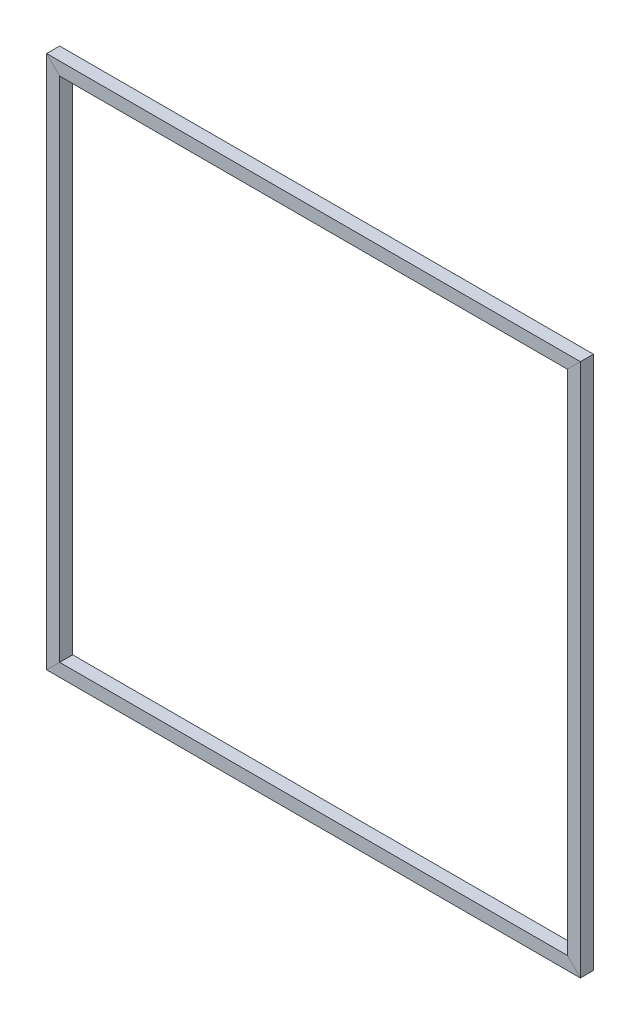
ISO-10303-21;
HEADER;
FILE_DESCRIPTION(('STEP AP214'),'2;1');
FILE_NAME('part.step','',(''),(''),'','','');
FILE_SCHEMA(('AUTOMOTIVE_DESIGN { 1 0 10303 214 1 1 1 1 }'));
ENDSEC;
DATA;
#1=APPLICATION_CONTEXT('core data for automotive mechanical design processes');
#2=APPLICATION_PROTOCOL_DEFINITION('international standard','automotive_design',2000,#1);
#3=PRODUCT_CONTEXT('',#1,'mechanical');
#4=PRODUCT('Part','Part','',(#3));
#5=PRODUCT_RELATED_PRODUCT_CATEGORY('part','',(#4));
#6=PRODUCT_DEFINITION_FORMATION('','',#4);
#7=PRODUCT_DEFINITION_CONTEXT('part definition',#1,'design');
#8=PRODUCT_DEFINITION('design','',#6,#7);
#9=PRODUCT_DEFINITION_SHAPE('','',#8);
#10=(LENGTH_UNIT() NAMED_UNIT(*) SI_UNIT(.MILLI.,.METRE.));
#11=(NAMED_UNIT(*) PLANE_ANGLE_UNIT() SI_UNIT($,.RADIAN.));
#12=(NAMED_UNIT(*) SI_UNIT($,.STERADIAN.) SOLID_ANGLE_UNIT());
#13=UNCERTAINTY_MEASURE_WITH_UNIT(LENGTH_MEASURE(1.E-05),#10,'distance_accuracy_value','');
#14=(GEOMETRIC_REPRESENTATION_CONTEXT(3) GLOBAL_UNCERTAINTY_ASSIGNED_CONTEXT((#13)) GLOBAL_UNIT_ASSIGNED_CONTEXT((#10,
#11,#12)) REPRESENTATION_CONTEXT('',''));
#15=CARTESIAN_POINT('',(0.,0.,0.));
#16=DIRECTION('',(0.,0.,1.));
#17=DIRECTION('',(1.,0.,0.));
#18=AXIS2_PLACEMENT_3D('',#15,#16,#17);
#19=CARTESIAN_POINT('',(-4875.,5000.,-125.));
#20=DIRECTION('',(-1.,0.,0.));
#21=DIRECTION('',(0.,0.,1.));
#22=AXIS2_PLACEMENT_3D('',#19,#20,#21);
#23=PLANE('',#22);
#24=DIRECTION('',(0.,0.,1.));
#25=VECTOR('',#24,1.);
#26=CARTESIAN_POINT('',(-4875.,-4875.,-125.));
#27=LINE('',#26,#25);
#28=CARTESIAN_POINT('',(-4875.,-4875.,-125.));
#29=VERTEX_POINT('',#28);
#30=CARTESIAN_POINT('',(-4875.,-4875.,125.));
#31=VERTEX_POINT('',#30);
#32=EDGE_CURVE('E120',#29,#31,#27,.T.);
#33=ORIENTED_EDGE('',*,*,#32,.F.);
#34=DIRECTION('',(0.,-1.,0.));
#35=VECTOR('',#34,1.);
#36=CARTESIAN_POINT('',(-4875.,5000.,-125.));
#37=LINE('',#36,#35);
#38=CARTESIAN_POINT('',(-4875.,4875.,-125.));
#39=VERTEX_POINT('',#38);
#40=EDGE_CURVE('E128',#39,#29,#37,.T.);
#41=ORIENTED_EDGE('',*,*,#40,.F.);
#42=DIRECTION('',(0.,0.,-1.));
#43=VECTOR('',#42,1.);
#44=CARTESIAN_POINT('',(-4875.,4875.,-125.));
#45=LINE('',#44,#43);
#46=CARTESIAN_POINT('',(-4875.,4875.,125.));
#47=VERTEX_POINT('',#46);
#48=EDGE_CURVE('E112',#47,#39,#45,.T.);
#49=ORIENTED_EDGE('',*,*,#48,.F.);
#50=DIRECTION('',(0.,-1.,0.));
#51=VECTOR('',#50,1.);
#52=CARTESIAN_POINT('',(-4875.,5000.,125.));
#53=LINE('',#52,#51);
#54=EDGE_CURVE('E69',#47,#31,#53,.T.);
#55=ORIENTED_EDGE('',*,*,#54,.T.);
#56=EDGE_LOOP('',(#33,#41,#49,#55));
#57=FACE_BOUND('',#56,.T.);
#58=ADVANCED_FACE('F65',(#57),#23,.F.);
#59=CARTESIAN_POINT('',(-5125.,5000.,-125.));
#60=DIRECTION('',(0.,0.,1.));
#61=DIRECTION('',(1.,0.,0.));
#62=AXIS2_PLACEMENT_3D('',#59,#60,#61);
#63=PLANE('',#62);
#64=DIRECTION('',(0.707106781186547,0.707106781186548,0.));
#65=VECTOR('',#64,1.);
#66=CARTESIAN_POINT('',(-62.5,-62.5000000000009,-125.000000000001));
#67=LINE('',#66,#65);
#68=CARTESIAN_POINT('',(-5125.,-5125.,-125.));
#69=VERTEX_POINT('',#68);
#70=EDGE_CURVE('E117',#69,#29,#67,.T.);
#71=ORIENTED_EDGE('',*,*,#70,.F.);
#72=DIRECTION('',(0.,-1.,0.));
#73=VECTOR('',#72,1.);
#74=CARTESIAN_POINT('',(-5125.,5000.,-125.));
#75=LINE('',#74,#73);
#76=CARTESIAN_POINT('',(-5125.,5125.,-125.));
#77=VERTEX_POINT('',#76);
#78=EDGE_CURVE('E106',#77,#69,#75,.T.);
#79=ORIENTED_EDGE('',*,*,#78,.F.);
#80=DIRECTION('',(-0.707106781186548,0.707106781186547,0.));
#81=VECTOR('',#80,1.);
#82=CARTESIAN_POINT('',(-5062.5,5062.5,-125.));
#83=LINE('',#82,#81);
#84=EDGE_CURVE('E116',#39,#77,#83,.T.);
#85=ORIENTED_EDGE('',*,*,#84,.F.);
#86=ORIENTED_EDGE('',*,*,#40,.T.);
#87=EDGE_LOOP('',(#71,#79,#85,#86));
#88=FACE_BOUND('',#87,.T.);
#89=ADVANCED_FACE('F139',(#88),#63,.F.);
#90=CARTESIAN_POINT('',(-5125.,5000.,-125.));
#91=DIRECTION('',(1.,0.,0.));
#92=DIRECTION('',(0.,0.,-1.));
#93=AXIS2_PLACEMENT_3D('',#90,#91,#92);
#94=PLANE('',#93);
#95=DIRECTION('',(0.,0.,-1.));
#96=VECTOR('',#95,1.);
#97=CARTESIAN_POINT('',(-5125.,-5125.,-125.));
#98=LINE('',#97,#96);
#99=CARTESIAN_POINT('',(-5125.,-5125.,125.));
#100=VERTEX_POINT('',#99);
#101=EDGE_CURVE('E13',#100,#69,#98,.T.);
#102=ORIENTED_EDGE('',*,*,#101,.F.);
#103=DIRECTION('',(0.,-1.,0.));
#104=VECTOR('',#103,1.);
#105=CARTESIAN_POINT('',(-5125.,5000.,125.));
#106=LINE('',#105,#104);
#107=CARTESIAN_POINT('',(-5125.,5125.,125.));
#108=VERTEX_POINT('',#107);
#109=EDGE_CURVE('E82',#108,#100,#106,.T.);
#110=ORIENTED_EDGE('',*,*,#109,.F.);
#111=DIRECTION('',(0.,0.,1.));
#112=VECTOR('',#111,1.);
#113=CARTESIAN_POINT('',(-5125.,5125.,-125.));
#114=LINE('',#113,#112);
#115=EDGE_CURVE('E102',#77,#108,#114,.T.);
#116=ORIENTED_EDGE('',*,*,#115,.F.);
#117=ORIENTED_EDGE('',*,*,#78,.T.);
#118=EDGE_LOOP('',(#102,#110,#116,#117));
#119=FACE_BOUND('',#118,.T.);
#120=ADVANCED_FACE('F99',(#119),#94,.F.);
#121=CARTESIAN_POINT('',(-5125.,5000.,125.));
#122=DIRECTION('',(0.,0.,-1.));
#123=DIRECTION('',(-1.,0.,0.));
#124=AXIS2_PLACEMENT_3D('',#121,#122,#123);
#125=PLANE('',#124);
#126=DIRECTION('',(-0.707106781186547,-0.707106781186548,0.));
#127=VECTOR('',#126,1.);
#128=CARTESIAN_POINT('',(-62.5,-62.5000000000009,124.999999999999));
#129=LINE('',#128,#127);
#130=EDGE_CURVE('E74',#31,#100,#129,.T.);
#131=ORIENTED_EDGE('',*,*,#130,.F.);
#132=ORIENTED_EDGE('',*,*,#54,.F.);
#133=DIRECTION('',(0.707106781186548,-0.707106781186547,0.));
#134=VECTOR('',#133,1.);
#135=CARTESIAN_POINT('',(-5062.5,5062.5,125.));
#136=LINE('',#135,#134);
#137=EDGE_CURVE('E105',#108,#47,#136,.T.);
#138=ORIENTED_EDGE('',*,*,#137,.F.);
#139=ORIENTED_EDGE('',*,*,#109,.T.);
#140=EDGE_LOOP('',(#131,#132,#138,#139));
#141=FACE_BOUND('',#140,.T.);
#142=ADVANCED_FACE('F109',(#141),#125,.F.);
#143=CARTESIAN_POINT('',(-5000.,5000.,0.));
#144=DIRECTION('',(0.707106781186547,0.707106781186548,0.));
#145=DIRECTION('',(-0.707106781186548,0.707106781186547,0.));
#146=AXIS2_PLACEMENT_3D('',#143,#144,#145);
#147=PLANE('',#146);
#148=ORIENTED_EDGE('',*,*,#137,.T.);
#149=ORIENTED_EDGE('',*,*,#48,.T.);
#150=ORIENTED_EDGE('',*,*,#84,.T.);
#151=ORIENTED_EDGE('',*,*,#115,.T.);
#152=EDGE_LOOP('',(#148,#149,#150,#151));
#153=FACE_BOUND('',#152,.T.);
#154=ADVANCED_FACE('F115',(#153),#147,.T.);
#155=CARTESIAN_POINT('',(-5000.,-5000.,0.));
#156=DIRECTION('',(0.707106781186548,-0.707106781186547,0.));
#157=DIRECTION('',(0.707106781186547,0.707106781186548,0.));
#158=AXIS2_PLACEMENT_3D('',#155,#156,#157);
#159=PLANE('',#158);
#160=ORIENTED_EDGE('',*,*,#70,.T.);
#161=ORIENTED_EDGE('',*,*,#32,.T.);
#162=ORIENTED_EDGE('',*,*,#130,.T.);
#163=ORIENTED_EDGE('',*,*,#101,.T.);
#164=EDGE_LOOP('',(#160,#161,#162,#163));
#165=FACE_BOUND('',#164,.T.);
#166=ADVANCED_FACE('F67',(#165),#159,.T.);
#167=CLOSED_SHELL('',(#58,#89,#120,#142,#154,#166));
#168=MANIFOLD_SOLID_BREP('B2',#167);
#169=CARTESIAN_POINT('',(-5000.,-4875.,-125.));
#170=DIRECTION('',(0.,-1.,0.));
#171=DIRECTION('',(1.,0.,0.));
#172=AXIS2_PLACEMENT_3D('',#169,#170,#171);
#173=PLANE('',#172);
#174=DIRECTION('',(0.,0.,-1.));
#175=VECTOR('',#174,1.);
#176=CARTESIAN_POINT('',(-4875.,-4875.,-125.));
#177=LINE('',#176,#175);
#178=CARTESIAN_POINT('',(-4874.99999999998,-4874.99999999999,125.));
#179=VERTEX_POINT('',#178);
#180=CARTESIAN_POINT('',(-4875.,-4875.,-125.));
#181=VERTEX_POINT('',#180);
#182=EDGE_CURVE('E280',#179,#181,#177,.T.);
#183=ORIENTED_EDGE('',*,*,#182,.F.);
#184=DIRECTION('',(1.,0.,0.));
#185=VECTOR('',#184,1.);
#186=CARTESIAN_POINT('',(-5000.,-4875.,125.));
#187=LINE('',#186,#185);
#188=CARTESIAN_POINT('',(4875.,-4875.,125.));
#189=VERTEX_POINT('',#188);
#190=EDGE_CURVE('E235',#179,#189,#187,.T.);
#191=ORIENTED_EDGE('',*,*,#190,.T.);
#192=DIRECTION('',(0.,0.,1.));
#193=VECTOR('',#192,1.);
#194=CARTESIAN_POINT('',(4875.,-4875.,-125.));
#195=LINE('',#194,#193);
#196=CARTESIAN_POINT('',(4875.,-4875.,-125.));
#197=VERTEX_POINT('',#196);
#198=EDGE_CURVE('E284',#197,#189,#195,.T.);
#199=ORIENTED_EDGE('',*,*,#198,.F.);
#200=DIRECTION('',(1.,0.,0.));
#201=VECTOR('',#200,1.);
#202=CARTESIAN_POINT('',(-5000.,-4875.,-125.));
#203=LINE('',#202,#201);
#204=EDGE_CURVE('E276',#181,#197,#203,.T.);
#205=ORIENTED_EDGE('',*,*,#204,.F.);
#206=EDGE_LOOP('',(#183,#191,#199,#205));
#207=FACE_BOUND('',#206,.T.);
#208=ADVANCED_FACE('F231',(#207),#173,.F.);
#209=CARTESIAN_POINT('',(-5000.,-5125.,-125.));
#210=DIRECTION('',(0.,0.,1.));
#211=DIRECTION('',(0.,-1.,0.));
#212=AXIS2_PLACEMENT_3D('',#209,#210,#211);
#213=PLANE('',#212);
#214=DIRECTION('',(-0.707106781186547,-0.707106781186548,0.));
#215=VECTOR('',#214,1.);
#216=CARTESIAN_POINT('',(-5062.5,-5062.5,-125.));
#217=LINE('',#216,#215);
#218=CARTESIAN_POINT('',(-5125.,-5125.,-125.));
#219=VERTEX_POINT('',#218);
#220=EDGE_CURVE('E240',#181,#219,#217,.T.);
#221=ORIENTED_EDGE('',*,*,#220,.F.);
#222=ORIENTED_EDGE('',*,*,#204,.T.);
#223=DIRECTION('',(-0.707106781186547,0.707106781186548,0.));
#224=VECTOR('',#223,1.);
#225=CARTESIAN_POINT('',(62.5000000000027,-62.5000000000027,-125.000000000001));
#226=LINE('',#225,#224);
#227=CARTESIAN_POINT('',(5125.,-5125.,-125.));
#228=VERTEX_POINT('',#227);
#229=EDGE_CURVE('E292',#228,#197,#226,.T.);
#230=ORIENTED_EDGE('',*,*,#229,.F.);
#231=DIRECTION('',(1.,0.,0.));
#232=VECTOR('',#231,1.);
#233=CARTESIAN_POINT('',(-5000.,-5125.,-125.));
#234=LINE('',#233,#232);
#235=EDGE_CURVE('E277',#219,#228,#234,.T.);
#236=ORIENTED_EDGE('',*,*,#235,.F.);
#237=EDGE_LOOP('',(#221,#222,#230,#236));
#238=FACE_BOUND('',#237,.T.);
#239=ADVANCED_FACE('F274',(#238),#213,.F.);
#240=CARTESIAN_POINT('',(-5000.,-5125.,-125.));
#241=DIRECTION('',(0.,1.,0.));
#242=DIRECTION('',(-1.,0.,0.));
#243=AXIS2_PLACEMENT_3D('',#240,#241,#242);
#244=PLANE('',#243);
#245=DIRECTION('',(0.,0.,1.));
#246=VECTOR('',#245,1.);
#247=CARTESIAN_POINT('',(-5125.,-5125.,-125.));
#248=LINE('',#247,#246);
#249=CARTESIAN_POINT('',(-5125.,-5125.,125.));
#250=VERTEX_POINT('',#249);
#251=EDGE_CURVE('E63',#219,#250,#248,.T.);
#252=ORIENTED_EDGE('',*,*,#251,.F.);
#253=ORIENTED_EDGE('',*,*,#235,.T.);
#254=DIRECTION('',(0.,0.,-1.));
#255=VECTOR('',#254,1.);
#256=CARTESIAN_POINT('',(5125.,-5125.,-125.));
#257=LINE('',#256,#255);
#258=CARTESIAN_POINT('',(5125.,-5125.,125.));
#259=VERTEX_POINT('',#258);
#260=EDGE_CURVE('E288',#259,#228,#257,.T.);
#261=ORIENTED_EDGE('',*,*,#260,.F.);
#262=DIRECTION('',(1.,0.,0.));
#263=VECTOR('',#262,1.);
#264=CARTESIAN_POINT('',(-5000.,-5125.,125.));
#265=LINE('',#264,#263);
#266=EDGE_CURVE('E253',#250,#259,#265,.T.);
#267=ORIENTED_EDGE('',*,*,#266,.F.);
#268=EDGE_LOOP('',(#252,#253,#261,#267));
#269=FACE_BOUND('',#268,.T.);
#270=ADVANCED_FACE('F295',(#269),#244,.F.);
#271=CARTESIAN_POINT('',(-5000.,-5125.,125.));
#272=DIRECTION('',(0.,0.,-1.));
#273=DIRECTION('',(0.,1.,0.));
#274=AXIS2_PLACEMENT_3D('',#271,#272,#273);
#275=PLANE('',#274);
#276=DIRECTION('',(0.707106781186547,0.707106781186548,0.));
#277=VECTOR('',#276,1.);
#278=CARTESIAN_POINT('',(-5062.5,-5062.5,125.));
#279=LINE('',#278,#277);
#280=EDGE_CURVE('E286',#250,#179,#279,.T.);
#281=ORIENTED_EDGE('',*,*,#280,.F.);
#282=ORIENTED_EDGE('',*,*,#266,.T.);
#283=DIRECTION('',(0.707106781186547,-0.707106781186548,0.));
#284=VECTOR('',#283,1.);
#285=CARTESIAN_POINT('',(62.5000000000027,-62.5000000000027,124.999999999999));
#286=LINE('',#285,#284);
#287=EDGE_CURVE('E301',#189,#259,#286,.T.);
#288=ORIENTED_EDGE('',*,*,#287,.F.);
#289=ORIENTED_EDGE('',*,*,#190,.F.);
#290=EDGE_LOOP('',(#281,#282,#288,#289));
#291=FACE_BOUND('',#290,.T.);
#292=ADVANCED_FACE('F305',(#291),#275,.F.);
#293=CARTESIAN_POINT('',(5000.,-5000.,0.));
#294=DIRECTION('',(0.707106781186548,0.707106781186547,0.));
#295=DIRECTION('',(-0.707106781186547,0.707106781186548,0.));
#296=AXIS2_PLACEMENT_3D('',#293,#294,#295);
#297=PLANE('',#296);
#298=ORIENTED_EDGE('',*,*,#229,.T.);
#299=ORIENTED_EDGE('',*,*,#198,.T.);
#300=ORIENTED_EDGE('',*,*,#287,.T.);
#301=ORIENTED_EDGE('',*,*,#260,.T.);
#302=EDGE_LOOP('',(#298,#299,#300,#301));
#303=FACE_BOUND('',#302,.T.);
#304=ADVANCED_FACE('F300',(#303),#297,.T.);
#305=CARTESIAN_POINT('',(-5000.,-5000.,0.));
#306=DIRECTION('',(-0.707106781186548,0.707106781186547,0.));
#307=DIRECTION('',(-0.707106781186547,-0.707106781186548,0.));
#308=AXIS2_PLACEMENT_3D('',#305,#306,#307);
#309=PLANE('',#308);
#310=ORIENTED_EDGE('',*,*,#280,.T.);
#311=ORIENTED_EDGE('',*,*,#182,.T.);
#312=ORIENTED_EDGE('',*,*,#220,.T.);
#313=ORIENTED_EDGE('',*,*,#251,.T.);
#314=EDGE_LOOP('',(#310,#311,#312,#313));
#315=FACE_BOUND('',#314,.T.);
#316=ADVANCED_FACE('F233',(#315),#309,.T.);
#317=CLOSED_SHELL('',(#208,#239,#270,#292,#304,#316));
#318=MANIFOLD_SOLID_BREP('B7',#317);
#319=CARTESIAN_POINT('',(5000.,4875.,-125.));
#320=DIRECTION('',(0.,1.,0.));
#321=DIRECTION('',(-1.,0.,0.));
#322=AXIS2_PLACEMENT_3D('',#319,#320,#321);
#323=PLANE('',#322);
#324=DIRECTION('',(0.,0.,1.));
#325=VECTOR('',#324,1.);
#326=CARTESIAN_POINT('',(-4875.,4875.,-125.));
#327=LINE('',#326,#325);
#328=CARTESIAN_POINT('',(-4875.,4875.,-125.));
#329=VERTEX_POINT('',#328);
#330=CARTESIAN_POINT('',(-4875.,4875.,125.));
#331=VERTEX_POINT('',#330);
#332=EDGE_CURVE('E451',#329,#331,#327,.T.);
#333=ORIENTED_EDGE('',*,*,#332,.F.);
#334=DIRECTION('',(-1.,0.,0.));
#335=VECTOR('',#334,1.);
#336=CARTESIAN_POINT('',(5000.,4875.,-125.));
#337=LINE('',#336,#335);
#338=CARTESIAN_POINT('',(4875.,4875.,-125.));
#339=VERTEX_POINT('',#338);
#340=EDGE_CURVE('E459',#339,#329,#337,.T.);
#341=ORIENTED_EDGE('',*,*,#340,.F.);
#342=DIRECTION('',(0.,0.,-1.));
#343=VECTOR('',#342,1.);
#344=CARTESIAN_POINT('',(4875.,4875.,-125.));
#345=LINE('',#344,#343);
#346=CARTESIAN_POINT('',(4875.,4875.,125.));
#347=VERTEX_POINT('',#346);
#348=EDGE_CURVE('E443',#347,#339,#345,.T.);
#349=ORIENTED_EDGE('',*,*,#348,.F.);
#350=DIRECTION('',(-1.,0.,0.));
#351=VECTOR('',#350,1.);
#352=CARTESIAN_POINT('',(5000.,4875.,125.));
#353=LINE('',#352,#351);
#354=EDGE_CURVE('E400',#347,#331,#353,.T.);
#355=ORIENTED_EDGE('',*,*,#354,.T.);
#356=EDGE_LOOP('',(#333,#341,#349,#355));
#357=FACE_BOUND('',#356,.T.);
#358=ADVANCED_FACE('F396',(#357),#323,.F.);
#359=CARTESIAN_POINT('',(5000.,5125.,-125.));
#360=DIRECTION('',(0.,0.,1.));
#361=DIRECTION('',(0.,-1.,0.));
#362=AXIS2_PLACEMENT_3D('',#359,#360,#361);
#363=PLANE('',#362);
#364=DIRECTION('',(0.707106781186547,-0.707106781186548,0.));
#365=VECTOR('',#364,1.);
#366=CARTESIAN_POINT('',(-62.5000000000027,62.5000000000009,-125.000000000001));
#367=LINE('',#366,#365);
#368=CARTESIAN_POINT('',(-5125.,5125.,-125.));
#369=VERTEX_POINT('',#368);
#370=EDGE_CURVE('E448',#369,#329,#367,.T.);
#371=ORIENTED_EDGE('',*,*,#370,.F.);
#372=DIRECTION('',(-1.,0.,0.));
#373=VECTOR('',#372,1.);
#374=CARTESIAN_POINT('',(5000.,5125.,-125.));
#375=LINE('',#374,#373);
#376=CARTESIAN_POINT('',(5125.,5125.,-125.));
#377=VERTEX_POINT('',#376);
#378=EDGE_CURVE('E437',#377,#369,#375,.T.);
#379=ORIENTED_EDGE('',*,*,#378,.F.);
#380=DIRECTION('',(0.707106781186548,0.707106781186547,0.));
#381=VECTOR('',#380,1.);
#382=CARTESIAN_POINT('',(5062.5,5062.5,-125.));
#383=LINE('',#382,#381);
#384=EDGE_CURVE('E447',#339,#377,#383,.T.);
#385=ORIENTED_EDGE('',*,*,#384,.F.);
#386=ORIENTED_EDGE('',*,*,#340,.T.);
#387=EDGE_LOOP('',(#371,#379,#385,#386));
#388=FACE_BOUND('',#387,.T.);
#389=ADVANCED_FACE('F470',(#388),#363,.F.);
#390=CARTESIAN_POINT('',(5000.,5125.,-125.));
#391=DIRECTION('',(0.,-1.,0.));
#392=DIRECTION('',(1.,0.,0.));
#393=AXIS2_PLACEMENT_3D('',#390,#391,#392);
#394=PLANE('',#393);
#395=DIRECTION('',(0.,0.,-1.));
#396=VECTOR('',#395,1.);
#397=CARTESIAN_POINT('',(-5125.,5125.,-125.));
#398=LINE('',#397,#396);
#399=CARTESIAN_POINT('',(-5125.00000000001,5125.00000000001,125.));
#400=VERTEX_POINT('',#399);
#401=EDGE_CURVE('E229',#400,#369,#398,.T.);
#402=ORIENTED_EDGE('',*,*,#401,.F.);
#403=DIRECTION('',(-1.,0.,0.));
#404=VECTOR('',#403,1.);
#405=CARTESIAN_POINT('',(5000.,5125.,125.));
#406=LINE('',#405,#404);
#407=CARTESIAN_POINT('',(5125.,5125.,125.));
#408=VERTEX_POINT('',#407);
#409=EDGE_CURVE('E413',#408,#400,#406,.T.);
#410=ORIENTED_EDGE('',*,*,#409,.F.);
#411=DIRECTION('',(0.,0.,1.));
#412=VECTOR('',#411,1.);
#413=CARTESIAN_POINT('',(5125.,5125.,-125.));
#414=LINE('',#413,#412);
#415=EDGE_CURVE('E433',#377,#408,#414,.T.);
#416=ORIENTED_EDGE('',*,*,#415,.F.);
#417=ORIENTED_EDGE('',*,*,#378,.T.);
#418=EDGE_LOOP('',(#402,#410,#416,#417));
#419=FACE_BOUND('',#418,.T.);
#420=ADVANCED_FACE('F430',(#419),#394,.F.);
#421=CARTESIAN_POINT('',(5000.,5125.,125.));
#422=DIRECTION('',(0.,0.,-1.));
#423=DIRECTION('',(0.,1.,0.));
#424=AXIS2_PLACEMENT_3D('',#421,#422,#423);
#425=PLANE('',#424);
#426=DIRECTION('',(-0.707106781186547,0.707106781186548,0.));
#427=VECTOR('',#426,1.);
#428=CARTESIAN_POINT('',(-62.5000000000027,62.5000000000009,124.999999999999));
#429=LINE('',#428,#427);
#430=EDGE_CURVE('E405',#331,#400,#429,.T.);
#431=ORIENTED_EDGE('',*,*,#430,.F.);
#432=ORIENTED_EDGE('',*,*,#354,.F.);
#433=DIRECTION('',(-0.707106781186548,-0.707106781186547,0.));
#434=VECTOR('',#433,1.);
#435=CARTESIAN_POINT('',(5062.5,5062.5,125.));
#436=LINE('',#435,#434);
#437=EDGE_CURVE('E436',#408,#347,#436,.T.);
#438=ORIENTED_EDGE('',*,*,#437,.F.);
#439=ORIENTED_EDGE('',*,*,#409,.T.);
#440=EDGE_LOOP('',(#431,#432,#438,#439));
#441=FACE_BOUND('',#440,.T.);
#442=ADVANCED_FACE('F440',(#441),#425,.F.);
#443=CARTESIAN_POINT('',(5000.,5000.,0.));
#444=DIRECTION('',(0.707106781186547,-0.707106781186548,0.));
#445=DIRECTION('',(0.707106781186548,0.707106781186547,0.));
#446=AXIS2_PLACEMENT_3D('',#443,#444,#445);
#447=PLANE('',#446);
#448=ORIENTED_EDGE('',*,*,#437,.T.);
#449=ORIENTED_EDGE('',*,*,#348,.T.);
#450=ORIENTED_EDGE('',*,*,#384,.T.);
#451=ORIENTED_EDGE('',*,*,#415,.T.);
#452=EDGE_LOOP('',(#448,#449,#450,#451));
#453=FACE_BOUND('',#452,.T.);
#454=ADVANCED_FACE('F446',(#453),#447,.T.);
#455=CARTESIAN_POINT('',(-5000.,5000.,0.));
#456=DIRECTION('',(-0.707106781186548,-0.707106781186547,0.));
#457=DIRECTION('',(0.707106781186547,-0.707106781186548,0.));
#458=AXIS2_PLACEMENT_3D('',#455,#456,#457);
#459=PLANE('',#458);
#460=ORIENTED_EDGE('',*,*,#370,.T.);
#461=ORIENTED_EDGE('',*,*,#332,.T.);
#462=ORIENTED_EDGE('',*,*,#430,.T.);
#463=ORIENTED_EDGE('',*,*,#401,.T.);
#464=EDGE_LOOP('',(#460,#461,#462,#463));
#465=FACE_BOUND('',#464,.T.);
#466=ADVANCED_FACE('F398',(#465),#459,.T.);
#467=CLOSED_SHELL('',(#358,#389,#420,#442,#454,#466));
#468=MANIFOLD_SOLID_BREP('B57',#467);
#469=CARTESIAN_POINT('',(4875.,-5000.,-125.));
#470=DIRECTION('',(1.,0.,0.));
#471=DIRECTION('',(0.,0.,-1.));
#472=AXIS2_PLACEMENT_3D('',#469,#470,#471);
#473=PLANE('',#472);
#474=DIRECTION('',(0.,0.,1.));
#475=VECTOR('',#474,1.);
#476=CARTESIAN_POINT('',(4875.,4875.,-125.));
#477=LINE('',#476,#475);
#478=CARTESIAN_POINT('',(4875.,4875.,-125.));
#479=VERTEX_POINT('',#478);
#480=CARTESIAN_POINT('',(4875.,4875.,125.));
#481=VERTEX_POINT('',#480);
#482=EDGE_CURVE('E607',#479,#481,#477,.T.);
#483=ORIENTED_EDGE('',*,*,#482,.F.);
#484=DIRECTION('',(0.,1.,0.));
#485=VECTOR('',#484,1.);
#486=CARTESIAN_POINT('',(4875.,-5000.,-125.));
#487=LINE('',#486,#485);
#488=CARTESIAN_POINT('',(4875.,-4875.,-125.));
#489=VERTEX_POINT('',#488);
#490=EDGE_CURVE('E615',#489,#479,#487,.T.);
#491=ORIENTED_EDGE('',*,*,#490,.F.);
#492=DIRECTION('',(0.,0.,-1.));
#493=VECTOR('',#492,1.);
#494=CARTESIAN_POINT('',(4875.,-4875.,-125.));
#495=LINE('',#494,#493);
#496=CARTESIAN_POINT('',(4875.,-4875.,125.));
#497=VERTEX_POINT('',#496);
#498=EDGE_CURVE('E599',#497,#489,#495,.T.);
#499=ORIENTED_EDGE('',*,*,#498,.F.);
#500=DIRECTION('',(0.,1.,0.));
#501=VECTOR('',#500,1.);
#502=CARTESIAN_POINT('',(4875.,-5000.,125.));
#503=LINE('',#502,#501);
#504=EDGE_CURVE('E556',#497,#481,#503,.T.);
#505=ORIENTED_EDGE('',*,*,#504,.T.);
#506=EDGE_LOOP('',(#483,#491,#499,#505));
#507=FACE_BOUND('',#506,.T.);
#508=ADVANCED_FACE('F552',(#507),#473,.F.);
#509=CARTESIAN_POINT('',(5125.,-5000.,-125.));
#510=DIRECTION('',(0.,0.,1.));
#511=DIRECTION('',(1.,0.,0.));
#512=AXIS2_PLACEMENT_3D('',#509,#510,#511);
#513=PLANE('',#512);
#514=DIRECTION('',(-0.707106781186548,-0.707106781186547,0.));
#515=VECTOR('',#514,1.);
#516=CARTESIAN_POINT('',(62.5000000000009,62.5000000000018,-125.000000000001));
#517=LINE('',#516,#515);
#518=CARTESIAN_POINT('',(5125.,5125.,-125.));
#519=VERTEX_POINT('',#518);
#520=EDGE_CURVE('E604',#519,#479,#517,.T.);
#521=ORIENTED_EDGE('',*,*,#520,.F.);
#522=DIRECTION('',(0.,1.,0.));
#523=VECTOR('',#522,1.);
#524=CARTESIAN_POINT('',(5125.,-5000.,-125.));
#525=LINE('',#524,#523);
#526=CARTESIAN_POINT('',(5125.,-5125.,-125.));
#527=VERTEX_POINT('',#526);
#528=EDGE_CURVE('E593',#527,#519,#525,.T.);
#529=ORIENTED_EDGE('',*,*,#528,.F.);
#530=DIRECTION('',(0.707106781186548,-0.707106781186547,0.));
#531=VECTOR('',#530,1.);
#532=CARTESIAN_POINT('',(5062.5,-5062.5,-125.));
#533=LINE('',#532,#531);
#534=EDGE_CURVE('E603',#489,#527,#533,.T.);
#535=ORIENTED_EDGE('',*,*,#534,.F.);
#536=ORIENTED_EDGE('',*,*,#490,.T.);
#537=EDGE_LOOP('',(#521,#529,#535,#536));
#538=FACE_BOUND('',#537,.T.);
#539=ADVANCED_FACE('F626',(#538),#513,.F.);
#540=CARTESIAN_POINT('',(5125.,-5000.,-125.));
#541=DIRECTION('',(-1.,0.,0.));
#542=DIRECTION('',(0.,0.,1.));
#543=AXIS2_PLACEMENT_3D('',#540,#541,#542);
#544=PLANE('',#543);
#545=DIRECTION('',(0.,0.,-1.));
#546=VECTOR('',#545,1.);
#547=CARTESIAN_POINT('',(5125.,5125.,-125.));
#548=LINE('',#547,#546);
#549=CARTESIAN_POINT('',(5125.,5125.,125.));
#550=VERTEX_POINT('',#549);
#551=EDGE_CURVE('E394',#550,#519,#548,.T.);
#552=ORIENTED_EDGE('',*,*,#551,.F.);
#553=DIRECTION('',(0.,1.,0.));
#554=VECTOR('',#553,1.);
#555=CARTESIAN_POINT('',(5125.,-5000.,125.));
#556=LINE('',#555,#554);
#557=CARTESIAN_POINT('',(5125.,-5125.,125.));
#558=VERTEX_POINT('',#557);
#559=EDGE_CURVE('E569',#558,#550,#556,.T.);
#560=ORIENTED_EDGE('',*,*,#559,.F.);
#561=DIRECTION('',(0.,0.,1.));
#562=VECTOR('',#561,1.);
#563=CARTESIAN_POINT('',(5125.,-5125.,-125.));
#564=LINE('',#563,#562);
#565=EDGE_CURVE('E589',#527,#558,#564,.T.);
#566=ORIENTED_EDGE('',*,*,#565,.F.);
#567=ORIENTED_EDGE('',*,*,#528,.T.);
#568=EDGE_LOOP('',(#552,#560,#566,#567));
#569=FACE_BOUND('',#568,.T.);
#570=ADVANCED_FACE('F586',(#569),#544,.F.);
#571=CARTESIAN_POINT('',(5125.,-5000.,125.));
#572=DIRECTION('',(0.,0.,-1.));
#573=DIRECTION('',(-1.,0.,0.));
#574=AXIS2_PLACEMENT_3D('',#571,#572,#573);
#575=PLANE('',#574);
#576=DIRECTION('',(0.707106781186548,0.707106781186547,0.));
#577=VECTOR('',#576,1.);
#578=CARTESIAN_POINT('',(62.5000000000009,62.5000000000018,124.999999999999));
#579=LINE('',#578,#577);
#580=EDGE_CURVE('E561',#481,#550,#579,.T.);
#581=ORIENTED_EDGE('',*,*,#580,.F.);
#582=ORIENTED_EDGE('',*,*,#504,.F.);
#583=DIRECTION('',(-0.707106781186548,0.707106781186547,0.));
#584=VECTOR('',#583,1.);
#585=CARTESIAN_POINT('',(5062.5,-5062.5,125.));
#586=LINE('',#585,#584);
#587=EDGE_CURVE('E592',#558,#497,#586,.T.);
#588=ORIENTED_EDGE('',*,*,#587,.F.);
#589=ORIENTED_EDGE('',*,*,#559,.T.);
#590=EDGE_LOOP('',(#581,#582,#588,#589));
#591=FACE_BOUND('',#590,.T.);
#592=ADVANCED_FACE('F596',(#591),#575,.F.);
#593=CARTESIAN_POINT('',(5000.,-5000.,0.));
#594=DIRECTION('',(-0.707106781186547,-0.707106781186548,0.));
#595=DIRECTION('',(0.707106781186548,-0.707106781186547,0.));
#596=AXIS2_PLACEMENT_3D('',#593,#594,#595);
#597=PLANE('',#596);
#598=ORIENTED_EDGE('',*,*,#587,.T.);
#599=ORIENTED_EDGE('',*,*,#498,.T.);
#600=ORIENTED_EDGE('',*,*,#534,.T.);
#601=ORIENTED_EDGE('',*,*,#565,.T.);
#602=EDGE_LOOP('',(#598,#599,#600,#601));
#603=FACE_BOUND('',#602,.T.);
#604=ADVANCED_FACE('F602',(#603),#597,.T.);
#605=CARTESIAN_POINT('',(5000.,5000.,0.));
#606=DIRECTION('',(-0.707106781186547,0.707106781186548,0.));
#607=DIRECTION('',(-0.707106781186548,-0.707106781186547,0.));
#608=AXIS2_PLACEMENT_3D('',#605,#606,#607);
#609=PLANE('',#608);
#610=ORIENTED_EDGE('',*,*,#520,.T.);
#611=ORIENTED_EDGE('',*,*,#482,.T.);
#612=ORIENTED_EDGE('',*,*,#580,.T.);
#613=ORIENTED_EDGE('',*,*,#551,.T.);
#614=EDGE_LOOP('',(#610,#611,#612,#613));
#615=FACE_BOUND('',#614,.T.);
#616=ADVANCED_FACE('F554',(#615),#609,.T.);
#617=CLOSED_SHELL('',(#508,#539,#570,#592,#604,#616));
#618=MANIFOLD_SOLID_BREP('B223',#617);
#619=ADVANCED_BREP_SHAPE_REPRESENTATION('',(#18,#168,#318,#468,#618),#14);
#620=SHAPE_DEFINITION_REPRESENTATION(#9,#619);
ENDSEC;
END-ISO-10303-21;
